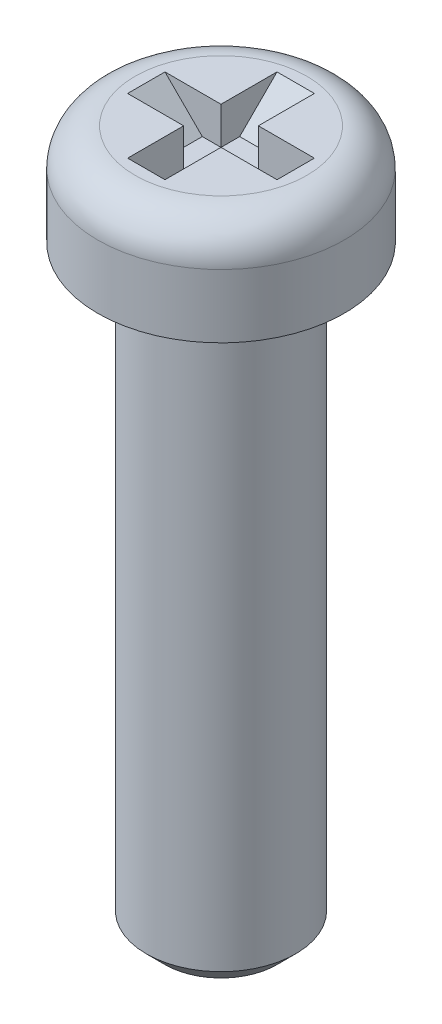
ISO-10303-21;
HEADER;
FILE_DESCRIPTION(('STEP AP214'),'2;1');
FILE_NAME('part.step','',(''),(''),'','','');
FILE_SCHEMA(('AUTOMOTIVE_DESIGN { 1 0 10303 214 1 1 1 1 }'));
ENDSEC;
DATA;
#1=APPLICATION_CONTEXT('core data for automotive mechanical design processes');
#2=APPLICATION_PROTOCOL_DEFINITION('international standard','automotive_design',2000,#1);
#3=PRODUCT_CONTEXT('',#1,'mechanical');
#4=PRODUCT('Part','Part','',(#3));
#5=PRODUCT_RELATED_PRODUCT_CATEGORY('part','',(#4));
#6=PRODUCT_DEFINITION_FORMATION('','',#4);
#7=PRODUCT_DEFINITION_CONTEXT('part definition',#1,'design');
#8=PRODUCT_DEFINITION('design','',#6,#7);
#9=PRODUCT_DEFINITION_SHAPE('','',#8);
#10=(LENGTH_UNIT() NAMED_UNIT(*) SI_UNIT(.MILLI.,.METRE.));
#11=(NAMED_UNIT(*) PLANE_ANGLE_UNIT() SI_UNIT($,.RADIAN.));
#12=(NAMED_UNIT(*) SI_UNIT($,.STERADIAN.) SOLID_ANGLE_UNIT());
#13=UNCERTAINTY_MEASURE_WITH_UNIT(LENGTH_MEASURE(1.E-05),#10,'distance_accuracy_value','');
#14=(GEOMETRIC_REPRESENTATION_CONTEXT(3) GLOBAL_UNCERTAINTY_ASSIGNED_CONTEXT((#13)) GLOBAL_UNIT_ASSIGNED_CONTEXT((#10,
#11,#12)) REPRESENTATION_CONTEXT('',''));
#15=CARTESIAN_POINT('',(0.,0.,0.));
#16=DIRECTION('',(0.,0.,1.));
#17=DIRECTION('',(1.,0.,0.));
#18=AXIS2_PLACEMENT_3D('',#15,#16,#17);
#19=CARTESIAN_POINT('',(0.,16.,0.));
#20=DIRECTION('',(0.,-1.,0.));
#21=DIRECTION('',(0.,0.,-1.));
#22=AXIS2_PLACEMENT_3D('',#19,#20,#21);
#23=CYLINDRICAL_SURFACE('',#22,2.);
#24=CARTESIAN_POINT('',(0.,0.5,0.));
#25=DIRECTION('',(0.,1.,0.));
#26=DIRECTION('',(0.,0.,1.));
#27=AXIS2_PLACEMENT_3D('',#24,#25,#26);
#28=CIRCLE('',#27,2.);
#29=CARTESIAN_POINT('',(0.,0.5,2.));
#30=VERTEX_POINT('',#29);
#31=EDGE_CURVE('E245',#30,#30,#28,.T.);
#32=ORIENTED_EDGE('',*,*,#31,.T.);
#33=EDGE_LOOP('',(#32));
#34=FACE_BOUND('',#33,.T.);
#35=CARTESIAN_POINT('',(0.,16.,0.));
#36=DIRECTION('',(0.,1.,0.));
#37=DIRECTION('',(0.,0.,1.));
#38=AXIS2_PLACEMENT_3D('',#35,#36,#37);
#39=CIRCLE('',#38,2.);
#40=CARTESIAN_POINT('',(0.,16.,2.));
#41=VERTEX_POINT('',#40);
#42=EDGE_CURVE('E231',#41,#41,#39,.T.);
#43=ORIENTED_EDGE('',*,*,#42,.F.);
#44=EDGE_LOOP('',(#43));
#45=FACE_BOUND('',#44,.T.);
#46=ADVANCED_FACE('F66',(#34,#45),#23,.T.);
#47=CARTESIAN_POINT('',(0.,0.,0.));
#48=DIRECTION('',(0.,1.,0.));
#49=DIRECTION('',(0.,0.,1.));
#50=AXIS2_PLACEMENT_3D('',#47,#48,#49);
#51=PLANE('',#50);
#52=CARTESIAN_POINT('',(0.,0.,0.));
#53=DIRECTION('',(0.,1.,0.));
#54=DIRECTION('',(0.,0.,1.));
#55=AXIS2_PLACEMENT_3D('',#52,#53,#54);
#56=CIRCLE('',#55,1.5);
#57=CARTESIAN_POINT('',(0.,0.,1.5));
#58=VERTEX_POINT('',#57);
#59=EDGE_CURVE('E244',#58,#58,#56,.F.);
#60=ORIENTED_EDGE('',*,*,#59,.T.);
#61=EDGE_LOOP('',(#60));
#62=FACE_BOUND('',#61,.T.);
#63=ADVANCED_FACE('F309',(#62),#51,.F.);
#64=CARTESIAN_POINT('',(0.,18.7,0.));
#65=DIRECTION('',(0.,-1.,0.));
#66=DIRECTION('',(0.,0.,-1.));
#67=AXIS2_PLACEMENT_3D('',#64,#65,#66);
#68=CYLINDRICAL_SURFACE('',#67,3.3);
#69=CARTESIAN_POINT('',(0.,17.7,0.));
#70=DIRECTION('',(0.,1.,0.));
#71=DIRECTION('',(0.,0.,1.));
#72=AXIS2_PLACEMENT_3D('',#69,#70,#71);
#73=CIRCLE('',#72,3.3);
#74=CARTESIAN_POINT('',(0.,17.7,-3.3));
#75=VERTEX_POINT('',#74);
#76=EDGE_CURVE('E237',#75,#75,#73,.F.);
#77=CARTESIAN_POINT('',(0.,16.,0.));
#78=DIRECTION('',(0.,1.,0.));
#79=DIRECTION('',(0.,0.,1.));
#80=AXIS2_PLACEMENT_3D('',#77,#78,#79);
#81=CIRCLE('',#80,3.3);
#82=CARTESIAN_POINT('',(0.,16.,-3.3));
#83=VERTEX_POINT('',#82);
#84=EDGE_CURVE('E219',#83,#83,#81,.T.);
#85=CARTESIAN_POINT('',(0.,17.7,-3.3));
#86=CARTESIAN_POINT('',(0.,17.6822916666667,-3.3));
#87=CARTESIAN_POINT('',(0.,17.6645833333333,-3.3));
#88=CARTESIAN_POINT('',(0.,17.6291666666667,-3.3));
#89=CARTESIAN_POINT('',(0.,17.6114583333333,-3.3));
#90=CARTESIAN_POINT('',(0.,17.5760416666667,-3.3));
#91=CARTESIAN_POINT('',(0.,17.5583333333333,-3.3));
#92=CARTESIAN_POINT('',(0.,17.5229166666667,-3.3));
#93=CARTESIAN_POINT('',(0.,17.5052083333333,-3.3));
#94=CARTESIAN_POINT('',(0.,17.4697916666667,-3.3));
#95=CARTESIAN_POINT('',(0.,17.4520833333333,-3.3));
#96=CARTESIAN_POINT('',(0.,17.4166666666667,-3.3));
#97=CARTESIAN_POINT('',(0.,17.3989583333333,-3.3));
#98=CARTESIAN_POINT('',(0.,17.3635416666667,-3.3));
#99=CARTESIAN_POINT('',(0.,17.3458333333333,-3.3));
#100=CARTESIAN_POINT('',(0.,17.3104166666667,-3.3));
#101=CARTESIAN_POINT('',(0.,17.2927083333333,-3.3));
#102=CARTESIAN_POINT('',(0.,17.2572916666667,-3.3));
#103=CARTESIAN_POINT('',(0.,17.2395833333333,-3.3));
#104=CARTESIAN_POINT('',(0.,17.2041666666667,-3.3));
#105=CARTESIAN_POINT('',(0.,17.1864583333333,-3.3));
#106=CARTESIAN_POINT('',(0.,17.1510416666667,-3.3));
#107=CARTESIAN_POINT('',(0.,17.1333333333333,-3.3));
#108=CARTESIAN_POINT('',(0.,17.0979166666667,-3.3));
#109=CARTESIAN_POINT('',(0.,17.0802083333333,-3.3));
#110=CARTESIAN_POINT('',(0.,17.0447916666667,-3.3));
#111=CARTESIAN_POINT('',(0.,17.0270833333333,-3.3));
#112=CARTESIAN_POINT('',(0.,16.9916666666667,-3.3));
#113=CARTESIAN_POINT('',(0.,16.9739583333333,-3.3));
#114=CARTESIAN_POINT('',(0.,16.9385416666667,-3.3));
#115=CARTESIAN_POINT('',(0.,16.9208333333333,-3.3));
#116=CARTESIAN_POINT('',(0.,16.8854166666667,-3.3));
#117=CARTESIAN_POINT('',(0.,16.8677083333333,-3.3));
#118=CARTESIAN_POINT('',(0.,16.8322916666667,-3.3));
#119=CARTESIAN_POINT('',(0.,16.8145833333333,-3.3));
#120=CARTESIAN_POINT('',(0.,16.7791666666667,-3.3));
#121=CARTESIAN_POINT('',(0.,16.7614583333333,-3.3));
#122=CARTESIAN_POINT('',(0.,16.7260416666667,-3.3));
#123=CARTESIAN_POINT('',(0.,16.7083333333333,-3.3));
#124=CARTESIAN_POINT('',(0.,16.6729166666667,-3.3));
#125=CARTESIAN_POINT('',(0.,16.6552083333333,-3.3));
#126=CARTESIAN_POINT('',(0.,16.6197916666667,-3.3));
#127=CARTESIAN_POINT('',(0.,16.6020833333333,-3.3));
#128=CARTESIAN_POINT('',(0.,16.5666666666667,-3.3));
#129=CARTESIAN_POINT('',(0.,16.5489583333333,-3.3));
#130=CARTESIAN_POINT('',(0.,16.5135416666667,-3.3));
#131=CARTESIAN_POINT('',(0.,16.4958333333333,-3.3));
#132=CARTESIAN_POINT('',(0.,16.4604166666667,-3.3));
#133=CARTESIAN_POINT('',(0.,16.4427083333333,-3.3));
#134=CARTESIAN_POINT('',(0.,16.4072916666667,-3.3));
#135=CARTESIAN_POINT('',(0.,16.3895833333333,-3.3));
#136=CARTESIAN_POINT('',(0.,16.3541666666667,-3.3));
#137=CARTESIAN_POINT('',(0.,16.3364583333333,-3.3));
#138=CARTESIAN_POINT('',(0.,16.3010416666667,-3.3));
#139=CARTESIAN_POINT('',(0.,16.2833333333333,-3.3));
#140=CARTESIAN_POINT('',(0.,16.2479166666667,-3.3));
#141=CARTESIAN_POINT('',(0.,16.2302083333333,-3.3));
#142=CARTESIAN_POINT('',(0.,16.1947916666667,-3.3));
#143=CARTESIAN_POINT('',(0.,16.1770833333333,-3.3));
#144=CARTESIAN_POINT('',(0.,16.1416666666667,-3.3));
#145=CARTESIAN_POINT('',(0.,16.1239583333333,-3.3));
#146=CARTESIAN_POINT('',(0.,16.0885416666667,-3.3));
#147=CARTESIAN_POINT('',(0.,16.0708333333333,-3.3));
#148=CARTESIAN_POINT('',(0.,16.0354166666667,-3.3));
#149=CARTESIAN_POINT('',(0.,16.0177083333333,-3.3));
#150=CARTESIAN_POINT('',(0.,16.,-3.3));
#151=B_SPLINE_CURVE_WITH_KNOTS('',3,(#85,#86,#87,#88,#89,#90,#91,#92,#93,#94,#95,#96,#97,#98,
#99,#100,#101,#102,#103,#104,#105,#106,#107,#108,#109,#110,#111,#112,#113,#114,#115,#116,#117,
#118,#119,#120,#121,#122,#123,#124,#125,#126,#127,#128,#129,#130,#131,#132,#133,#134,#135,#136,
#137,#138,#139,#140,#141,#142,#143,#144,#145,#146,#147,#148,#149,#150),.UNSPECIFIED.,.F.,.F.,(4,
2,2,2,2,2,2,2,2,2,2,2,2,2,2,2,2,2,2,2,2,2,2,2,2,2,2,2,2,2,2,2,4),(0.,0.0531249999999976,
0.106249999999999,0.159375,0.212499999999997,0.265624999999999,0.31875,0.371874999999997,
0.424999999999998,0.478124999999999,0.531249999999997,0.584374999999998,0.637499999999999,
0.690625,0.743749999999998,0.796874999999999,0.85,0.903124999999998,0.956249999999999,1.009375,
1.0625,1.115625,1.16875,1.221875,1.275,1.328125,1.38125,1.434375,1.4875,1.540625,1.59375,
1.646875,1.7),.UNSPECIFIED.);
#152=EDGE_CURVE('BSEAM317',#75,#83,#151,.T.);
#153=ORIENTED_EDGE('',*,*,#76,.T.);
#154=ORIENTED_EDGE('',*,*,#84,.T.);
#155=ORIENTED_EDGE('',*,*,#152,.T.);
#156=ORIENTED_EDGE('',*,*,#152,.F.);
#157=EDGE_LOOP('',(#153,#155,#154,#156));
#158=FACE_BOUND('',#157,.T.);
#159=ADVANCED_FACE('F317',(#158),#68,.T.);
#160=CARTESIAN_POINT('',(0.,18.7,0.));
#161=DIRECTION('',(0.,1.,0.));
#162=DIRECTION('',(0.,0.,1.));
#163=AXIS2_PLACEMENT_3D('',#160,#161,#162);
#164=PLANE('',#163);
#165=DIRECTION('',(0.,0.,-1.));
#166=VECTOR('',#165,1.);
#167=CARTESIAN_POINT('',(-0.5,18.7,-2.));
#168=LINE('',#167,#166);
#169=CARTESIAN_POINT('',(-0.5,18.7,-2.));
#170=VERTEX_POINT('',#169);
#171=CARTESIAN_POINT('',(-0.5,18.7,-0.5));
#172=VERTEX_POINT('',#171);
#173=EDGE_CURVE('E190',#170,#172,#168,.F.);
#174=ORIENTED_EDGE('',*,*,#173,.F.);
#175=DIRECTION('',(1.,0.,0.));
#176=VECTOR('',#175,1.);
#177=CARTESIAN_POINT('',(-0.5,18.7,-2.));
#178=LINE('',#177,#176);
#179=CARTESIAN_POINT('',(0.5,18.7,-2.));
#180=VERTEX_POINT('',#179);
#181=EDGE_CURVE('E193',#170,#180,#178,.T.);
#182=ORIENTED_EDGE('',*,*,#181,.T.);
#183=DIRECTION('',(0.,0.,-1.));
#184=VECTOR('',#183,1.);
#185=CARTESIAN_POINT('',(0.5,18.7,-2.));
#186=LINE('',#185,#184);
#187=CARTESIAN_POINT('',(0.5,18.7,-0.5));
#188=VERTEX_POINT('',#187);
#189=EDGE_CURVE('E185',#180,#188,#186,.F.);
#190=ORIENTED_EDGE('',*,*,#189,.T.);
#191=DIRECTION('',(1.,0.,0.));
#192=VECTOR('',#191,1.);
#193=CARTESIAN_POINT('',(-2.,18.7,-0.5));
#194=LINE('',#193,#192);
#195=CARTESIAN_POINT('',(2.,18.7,-0.500000000000001));
#196=VERTEX_POINT('',#195);
#197=EDGE_CURVE('E221',#188,#196,#194,.T.);
#198=ORIENTED_EDGE('',*,*,#197,.T.);
#199=DIRECTION('',(0.,0.,1.));
#200=VECTOR('',#199,1.);
#201=CARTESIAN_POINT('',(2.,18.7,-0.500000000000001));
#202=LINE('',#201,#200);
#203=CARTESIAN_POINT('',(2.,18.7,0.499999999999999));
#204=VERTEX_POINT('',#203);
#205=EDGE_CURVE('E225',#196,#204,#202,.T.);
#206=ORIENTED_EDGE('',*,*,#205,.T.);
#207=DIRECTION('',(1.,0.,0.));
#208=VECTOR('',#207,1.);
#209=CARTESIAN_POINT('',(-2.,18.7,0.5));
#210=LINE('',#209,#208);
#211=CARTESIAN_POINT('',(0.5,18.7,0.5));
#212=VERTEX_POINT('',#211);
#213=EDGE_CURVE('E181',#212,#204,#210,.T.);
#214=ORIENTED_EDGE('',*,*,#213,.F.);
#215=CARTESIAN_POINT('',(0.5,18.7,2.));
#216=VERTEX_POINT('',#215);
#217=EDGE_CURVE('E162',#212,#216,#186,.F.);
#218=ORIENTED_EDGE('',*,*,#217,.T.);
#219=DIRECTION('',(-1.,0.,0.));
#220=VECTOR('',#219,1.);
#221=CARTESIAN_POINT('',(0.5,18.7,2.));
#222=LINE('',#221,#220);
#223=CARTESIAN_POINT('',(-0.5,18.7,2.));
#224=VERTEX_POINT('',#223);
#225=EDGE_CURVE('E178',#216,#224,#222,.T.);
#226=ORIENTED_EDGE('',*,*,#225,.T.);
#227=CARTESIAN_POINT('',(-0.5,18.7,0.5));
#228=VERTEX_POINT('',#227);
#229=EDGE_CURVE('E188',#228,#224,#168,.F.);
#230=ORIENTED_EDGE('',*,*,#229,.F.);
#231=CARTESIAN_POINT('',(-2.,18.7,0.5));
#232=VERTEX_POINT('',#231);
#233=EDGE_CURVE('E216',#232,#228,#210,.T.);
#234=ORIENTED_EDGE('',*,*,#233,.F.);
#235=DIRECTION('',(0.,0.,-1.));
#236=VECTOR('',#235,1.);
#237=CARTESIAN_POINT('',(-2.,18.7,0.5));
#238=LINE('',#237,#236);
#239=CARTESIAN_POINT('',(-2.,18.7,-0.5));
#240=VERTEX_POINT('',#239);
#241=EDGE_CURVE('E226',#232,#240,#238,.T.);
#242=ORIENTED_EDGE('',*,*,#241,.T.);
#243=EDGE_CURVE('E223',#240,#172,#194,.T.);
#244=ORIENTED_EDGE('',*,*,#243,.T.);
#245=EDGE_LOOP('',(#174,#182,#190,#198,#206,#214,#218,#226,#230,#234,#242,#244));
#246=FACE_BOUND('',#245,.T.);
#247=CARTESIAN_POINT('',(0.,18.7,0.));
#248=DIRECTION('',(0.,1.,0.));
#249=DIRECTION('',(0.,0.,1.));
#250=AXIS2_PLACEMENT_3D('',#247,#248,#249);
#251=CIRCLE('',#250,2.3);
#252=CARTESIAN_POINT('',(0.,18.7,2.3));
#253=VERTEX_POINT('',#252);
#254=EDGE_CURVE('E236',#253,#253,#251,.T.);
#255=ORIENTED_EDGE('',*,*,#254,.T.);
#256=EDGE_LOOP('',(#255));
#257=FACE_BOUND('',#256,.T.);
#258=ADVANCED_FACE('F174',(#246,#257),#164,.T.);
#259=CARTESIAN_POINT('',(0.,16.,0.));
#260=DIRECTION('',(0.,1.,0.));
#261=DIRECTION('',(0.,0.,1.));
#262=AXIS2_PLACEMENT_3D('',#259,#260,#261);
#263=PLANE('',#262);
#264=ORIENTED_EDGE('',*,*,#42,.T.);
#265=EDGE_LOOP('',(#264));
#266=FACE_BOUND('',#265,.T.);
#267=ORIENTED_EDGE('',*,*,#84,.F.);
#268=EDGE_LOOP('',(#267));
#269=FACE_BOUND('',#268,.T.);
#270=ADVANCED_FACE('F324',(#266,#269),#263,.F.);
#271=CARTESIAN_POINT('',(0.,17.7,0.));
#272=DIRECTION('',(0.,1.,0.));
#273=DIRECTION('',(0.,0.,1.));
#274=AXIS2_PLACEMENT_3D('',#271,#272,#273);
#275=TOROIDAL_SURFACE('',#274,2.3,1.);
#276=ORIENTED_EDGE('',*,*,#76,.F.);
#277=EDGE_LOOP('',(#276));
#278=FACE_BOUND('',#277,.T.);
#279=ORIENTED_EDGE('',*,*,#254,.F.);
#280=EDGE_LOOP('',(#279));
#281=FACE_BOUND('',#280,.T.);
#282=ADVANCED_FACE('F302',(#278,#281),#275,.T.);
#283=CARTESIAN_POINT('',(0.,0.5,0.));
#284=DIRECTION('',(0.,1.,0.));
#285=DIRECTION('',(0.,0.,1.));
#286=AXIS2_PLACEMENT_3D('',#283,#284,#285);
#287=CONICAL_SURFACE('',#286,2.,0.78539816339745);
#288=ORIENTED_EDGE('',*,*,#59,.F.);
#289=EDGE_LOOP('',(#288));
#290=FACE_BOUND('',#289,.T.);
#291=ORIENTED_EDGE('',*,*,#31,.F.);
#292=EDGE_LOOP('',(#291));
#293=FACE_BOUND('',#292,.T.);
#294=ADVANCED_FACE('F298',(#290,#293),#287,.T.);
#295=CARTESIAN_POINT('',(-2.,17.7,0.5));
#296=DIRECTION('',(0.,0.,1.));
#297=DIRECTION('',(1.,0.,0.));
#298=AXIS2_PLACEMENT_3D('',#295,#296,#297);
#299=PLANE('',#298);
#300=ORIENTED_EDGE('',*,*,#213,.T.);
#301=DIRECTION('',(-0.707106781186545,-0.70710678118655,0.));
#302=VECTOR('',#301,1.);
#303=CARTESIAN_POINT('',(2.,18.7,0.499999999999999));
#304=LINE('',#303,#302);
#305=CARTESIAN_POINT('',(0.999999999999999,17.7,0.5));
#306=VERTEX_POINT('',#305);
#307=EDGE_CURVE('E166',#204,#306,#304,.T.);
#308=ORIENTED_EDGE('',*,*,#307,.T.);
#309=DIRECTION('',(1.,0.,0.));
#310=VECTOR('',#309,1.);
#311=CARTESIAN_POINT('',(-2.,17.7,0.5));
#312=LINE('',#311,#310);
#313=CARTESIAN_POINT('',(0.5,17.7,0.5));
#314=VERTEX_POINT('',#313);
#315=EDGE_CURVE('E211',#314,#306,#312,.T.);
#316=ORIENTED_EDGE('',*,*,#315,.F.);
#317=DIRECTION('',(0.,-1.,0.));
#318=VECTOR('',#317,1.);
#319=CARTESIAN_POINT('',(0.5,17.7,0.5));
#320=LINE('',#319,#318);
#321=EDGE_CURVE('E205',#212,#314,#320,.T.);
#322=ORIENTED_EDGE('',*,*,#321,.F.);
#323=EDGE_LOOP('',(#300,#308,#316,#322));
#324=FACE_BOUND('',#323,.T.);
#325=ADVANCED_FACE('F295',(#324),#299,.F.);
#326=CARTESIAN_POINT('',(-2.,17.7,-0.5));
#327=DIRECTION('',(0.,0.,1.));
#328=DIRECTION('',(1.,0.,0.));
#329=AXIS2_PLACEMENT_3D('',#326,#327,#328);
#330=PLANE('',#329);
#331=DIRECTION('',(1.,0.,0.));
#332=VECTOR('',#331,1.);
#333=CARTESIAN_POINT('',(-2.,17.7,-0.5));
#334=LINE('',#333,#332);
#335=CARTESIAN_POINT('',(0.5,17.7,-0.5));
#336=VERTEX_POINT('',#335);
#337=CARTESIAN_POINT('',(0.999999999999999,17.7,-0.5));
#338=VERTEX_POINT('',#337);
#339=EDGE_CURVE('E214',#336,#338,#334,.T.);
#340=ORIENTED_EDGE('',*,*,#339,.T.);
#341=DIRECTION('',(0.707106781186545,0.70710678118655,0.));
#342=VECTOR('',#341,1.);
#343=CARTESIAN_POINT('',(-0.49999999999999,16.2,-0.5));
#344=LINE('',#343,#342);
#345=EDGE_CURVE('E257',#338,#196,#344,.T.);
#346=ORIENTED_EDGE('',*,*,#345,.T.);
#347=ORIENTED_EDGE('',*,*,#197,.F.);
#348=DIRECTION('',(0.,-1.,0.));
#349=VECTOR('',#348,1.);
#350=CARTESIAN_POINT('',(0.5,17.7,-0.5));
#351=LINE('',#350,#349);
#352=EDGE_CURVE('E196',#188,#336,#351,.T.);
#353=ORIENTED_EDGE('',*,*,#352,.T.);
#354=EDGE_LOOP('',(#340,#346,#347,#353));
#355=FACE_BOUND('',#354,.T.);
#356=ADVANCED_FACE('F290',(#355),#330,.T.);
#357=CARTESIAN_POINT('',(-0.999999999999999,17.7,0.5));
#358=VERTEX_POINT('',#357);
#359=CARTESIAN_POINT('',(-0.5,17.7,0.5));
#360=VERTEX_POINT('',#359);
#361=EDGE_CURVE('E212',#358,#360,#312,.T.);
#362=ORIENTED_EDGE('',*,*,#361,.F.);
#363=DIRECTION('',(-0.707106781186545,0.70710678118655,0.));
#364=VECTOR('',#363,1.);
#365=CARTESIAN_POINT('',(-2.,18.7,0.5));
#366=LINE('',#365,#364);
#367=EDGE_CURVE('E12',#358,#232,#366,.T.);
#368=ORIENTED_EDGE('',*,*,#367,.T.);
#369=ORIENTED_EDGE('',*,*,#233,.T.);
#370=DIRECTION('',(0.,-1.,0.));
#371=VECTOR('',#370,1.);
#372=CARTESIAN_POINT('',(-0.5,17.7,0.5));
#373=LINE('',#372,#371);
#374=EDGE_CURVE('E206',#228,#360,#373,.T.);
#375=ORIENTED_EDGE('',*,*,#374,.T.);
#376=EDGE_LOOP('',(#362,#368,#369,#375));
#377=FACE_BOUND('',#376,.T.);
#378=ADVANCED_FACE('F274',(#377),#299,.F.);
#379=ORIENTED_EDGE('',*,*,#243,.F.);
#380=DIRECTION('',(0.707106781186545,-0.70710678118655,0.));
#381=VECTOR('',#380,1.);
#382=CARTESIAN_POINT('',(-1.5,18.2,-0.5));
#383=LINE('',#382,#381);
#384=CARTESIAN_POINT('',(-0.999999999999999,17.7,-0.5));
#385=VERTEX_POINT('',#384);
#386=EDGE_CURVE('E76',#240,#385,#383,.T.);
#387=ORIENTED_EDGE('',*,*,#386,.T.);
#388=CARTESIAN_POINT('',(-0.5,17.7,-0.5));
#389=VERTEX_POINT('',#388);
#390=EDGE_CURVE('E213',#385,#389,#334,.T.);
#391=ORIENTED_EDGE('',*,*,#390,.T.);
#392=DIRECTION('',(0.,-1.,0.));
#393=VECTOR('',#392,1.);
#394=CARTESIAN_POINT('',(-0.5,17.7,-0.5));
#395=LINE('',#394,#393);
#396=EDGE_CURVE('E203',#172,#389,#395,.T.);
#397=ORIENTED_EDGE('',*,*,#396,.F.);
#398=EDGE_LOOP('',(#379,#387,#391,#397));
#399=FACE_BOUND('',#398,.T.);
#400=ADVANCED_FACE('F264',(#399),#330,.T.);
#401=CARTESIAN_POINT('',(0.,17.7,0.));
#402=DIRECTION('',(0.,-1.,0.));
#403=DIRECTION('',(-1.,0.,0.));
#404=AXIS2_PLACEMENT_3D('',#401,#402,#403);
#405=PLANE('',#404);
#406=DIRECTION('',(0.,0.,-1.));
#407=VECTOR('',#406,1.);
#408=CARTESIAN_POINT('',(-0.5,17.7,-2.));
#409=LINE('',#408,#407);
#410=CARTESIAN_POINT('',(-0.5,17.7,0.999999999999999));
#411=VERTEX_POINT('',#410);
#412=EDGE_CURVE('E199',#360,#411,#409,.F.);
#413=ORIENTED_EDGE('',*,*,#412,.T.);
#414=DIRECTION('',(1.,0.,0.));
#415=VECTOR('',#414,1.);
#416=CARTESIAN_POINT('',(0.,17.7,0.999999999999999));
#417=LINE('',#416,#415);
#418=CARTESIAN_POINT('',(0.5,17.7,0.999999999999999));
#419=VERTEX_POINT('',#418);
#420=EDGE_CURVE('E169',#411,#419,#417,.T.);
#421=ORIENTED_EDGE('',*,*,#420,.T.);
#422=DIRECTION('',(0.,0.,-1.));
#423=VECTOR('',#422,1.);
#424=CARTESIAN_POINT('',(0.5,17.7,-2.));
#425=LINE('',#424,#423);
#426=EDGE_CURVE('E165',#314,#419,#425,.F.);
#427=ORIENTED_EDGE('',*,*,#426,.F.);
#428=ORIENTED_EDGE('',*,*,#315,.T.);
#429=DIRECTION('',(0.,0.,-1.));
#430=VECTOR('',#429,1.);
#431=CARTESIAN_POINT('',(0.999999999999999,17.7,0.));
#432=LINE('',#431,#430);
#433=EDGE_CURVE('E255',#306,#338,#432,.T.);
#434=ORIENTED_EDGE('',*,*,#433,.T.);
#435=ORIENTED_EDGE('',*,*,#339,.F.);
#436=CARTESIAN_POINT('',(0.5,17.7,-0.999999999999999));
#437=VERTEX_POINT('',#436);
#438=EDGE_CURVE('E204',#437,#336,#425,.F.);
#439=ORIENTED_EDGE('',*,*,#438,.F.);
#440=DIRECTION('',(-1.,0.,0.));
#441=VECTOR('',#440,1.);
#442=CARTESIAN_POINT('',(0.,17.7,-0.999999999999999));
#443=LINE('',#442,#441);
#444=CARTESIAN_POINT('',(-0.5,17.7,-0.999999999999999));
#445=VERTEX_POINT('',#444);
#446=EDGE_CURVE('E83',#437,#445,#443,.T.);
#447=ORIENTED_EDGE('',*,*,#446,.T.);
#448=EDGE_CURVE('E268',#445,#389,#409,.F.);
#449=ORIENTED_EDGE('',*,*,#448,.T.);
#450=ORIENTED_EDGE('',*,*,#390,.F.);
#451=DIRECTION('',(0.,0.,1.));
#452=VECTOR('',#451,1.);
#453=CARTESIAN_POINT('',(-0.999999999999999,17.7,0.));
#454=LINE('',#453,#452);
#455=EDGE_CURVE('E248',#385,#358,#454,.T.);
#456=ORIENTED_EDGE('',*,*,#455,.T.);
#457=ORIENTED_EDGE('',*,*,#361,.T.);
#458=EDGE_LOOP('',(#413,#421,#427,#428,#434,#435,#439,#447,#449,#450,#456,#457));
#459=FACE_BOUND('',#458,.T.);
#460=ADVANCED_FACE('F269',(#459),#405,.F.);
#461=CARTESIAN_POINT('',(0.5,17.7,-2.));
#462=DIRECTION('',(-1.,0.,0.));
#463=DIRECTION('',(0.,0.,1.));
#464=AXIS2_PLACEMENT_3D('',#461,#462,#463);
#465=PLANE('',#464);
#466=ORIENTED_EDGE('',*,*,#189,.F.);
#467=DIRECTION('',(0.,-0.70710678118655,0.707106781186545));
#468=VECTOR('',#467,1.);
#469=CARTESIAN_POINT('',(0.5,18.2,-1.5));
#470=LINE('',#469,#468);
#471=EDGE_CURVE('E94',#180,#437,#470,.T.);
#472=ORIENTED_EDGE('',*,*,#471,.T.);
#473=ORIENTED_EDGE('',*,*,#438,.T.);
#474=ORIENTED_EDGE('',*,*,#352,.F.);
#475=EDGE_LOOP('',(#466,#472,#473,#474));
#476=FACE_BOUND('',#475,.T.);
#477=ADVANCED_FACE('F282',(#476),#465,.T.);
#478=CARTESIAN_POINT('',(-0.5,17.7,-2.));
#479=DIRECTION('',(-1.,0.,0.));
#480=DIRECTION('',(0.,0.,1.));
#481=AXIS2_PLACEMENT_3D('',#478,#479,#480);
#482=PLANE('',#481);
#483=ORIENTED_EDGE('',*,*,#448,.F.);
#484=DIRECTION('',(0.,0.70710678118655,-0.707106781186545));
#485=VECTOR('',#484,1.);
#486=CARTESIAN_POINT('',(-0.5,18.7,-2.));
#487=LINE('',#486,#485);
#488=EDGE_CURVE('E256',#445,#170,#487,.T.);
#489=ORIENTED_EDGE('',*,*,#488,.T.);
#490=ORIENTED_EDGE('',*,*,#173,.T.);
#491=ORIENTED_EDGE('',*,*,#396,.T.);
#492=EDGE_LOOP('',(#483,#489,#490,#491));
#493=FACE_BOUND('',#492,.T.);
#494=ADVANCED_FACE('F348',(#493),#482,.F.);
#495=ORIENTED_EDGE('',*,*,#229,.T.);
#496=DIRECTION('',(0.,-0.70710678118655,-0.707106781186545));
#497=VECTOR('',#496,1.);
#498=CARTESIAN_POINT('',(-0.5,18.7,2.));
#499=LINE('',#498,#497);
#500=EDGE_CURVE('E184',#224,#411,#499,.T.);
#501=ORIENTED_EDGE('',*,*,#500,.T.);
#502=ORIENTED_EDGE('',*,*,#412,.F.);
#503=ORIENTED_EDGE('',*,*,#374,.F.);
#504=EDGE_LOOP('',(#495,#501,#502,#503));
#505=FACE_BOUND('',#504,.T.);
#506=ADVANCED_FACE('F277',(#505),#482,.F.);
#507=ORIENTED_EDGE('',*,*,#426,.T.);
#508=DIRECTION('',(0.,0.70710678118655,0.707106781186545));
#509=VECTOR('',#508,1.);
#510=CARTESIAN_POINT('',(0.5,16.2,-0.49999999999999));
#511=LINE('',#510,#509);
#512=EDGE_CURVE('E159',#419,#216,#511,.T.);
#513=ORIENTED_EDGE('',*,*,#512,.T.);
#514=ORIENTED_EDGE('',*,*,#217,.F.);
#515=ORIENTED_EDGE('',*,*,#321,.T.);
#516=EDGE_LOOP('',(#507,#513,#514,#515));
#517=FACE_BOUND('',#516,.T.);
#518=ADVANCED_FACE('F158',(#517),#465,.T.);
#519=CARTESIAN_POINT('',(0.5,18.7,2.));
#520=DIRECTION('',(0.,-0.707106781186545,0.70710678118655));
#521=DIRECTION('',(-1.,0.,0.));
#522=AXIS2_PLACEMENT_3D('',#519,#520,#521);
#523=PLANE('',#522);
#524=ORIENTED_EDGE('',*,*,#512,.F.);
#525=ORIENTED_EDGE('',*,*,#420,.F.);
#526=ORIENTED_EDGE('',*,*,#500,.F.);
#527=ORIENTED_EDGE('',*,*,#225,.F.);
#528=EDGE_LOOP('',(#524,#525,#526,#527));
#529=FACE_BOUND('',#528,.T.);
#530=ADVANCED_FACE('F183',(#529),#523,.F.);
#531=CARTESIAN_POINT('',(2.,18.7,-0.500000000000001));
#532=DIRECTION('',(0.70710678118655,-0.707106781186545,0.));
#533=DIRECTION('',(0.,0.,1.));
#534=AXIS2_PLACEMENT_3D('',#531,#532,#533);
#535=PLANE('',#534);
#536=ORIENTED_EDGE('',*,*,#345,.F.);
#537=ORIENTED_EDGE('',*,*,#433,.F.);
#538=ORIENTED_EDGE('',*,*,#307,.F.);
#539=ORIENTED_EDGE('',*,*,#205,.F.);
#540=EDGE_LOOP('',(#536,#537,#538,#539));
#541=FACE_BOUND('',#540,.T.);
#542=ADVANCED_FACE('F293',(#541),#535,.F.);
#543=CARTESIAN_POINT('',(-0.5,18.7,-2.));
#544=DIRECTION('',(0.,-0.707106781186545,-0.70710678118655));
#545=DIRECTION('',(1.,0.,0.));
#546=AXIS2_PLACEMENT_3D('',#543,#544,#545);
#547=PLANE('',#546);
#548=ORIENTED_EDGE('',*,*,#488,.F.);
#549=ORIENTED_EDGE('',*,*,#446,.F.);
#550=ORIENTED_EDGE('',*,*,#471,.F.);
#551=ORIENTED_EDGE('',*,*,#181,.F.);
#552=EDGE_LOOP('',(#548,#549,#550,#551));
#553=FACE_BOUND('',#552,.T.);
#554=ADVANCED_FACE('F339',(#553),#547,.F.);
#555=CARTESIAN_POINT('',(-2.,18.7,0.5));
#556=DIRECTION('',(-0.70710678118655,-0.707106781186545,0.));
#557=DIRECTION('',(0.,0.,-1.));
#558=AXIS2_PLACEMENT_3D('',#555,#556,#557);
#559=PLANE('',#558);
#560=ORIENTED_EDGE('',*,*,#367,.F.);
#561=ORIENTED_EDGE('',*,*,#455,.F.);
#562=ORIENTED_EDGE('',*,*,#386,.F.);
#563=ORIENTED_EDGE('',*,*,#241,.F.);
#564=EDGE_LOOP('',(#560,#561,#562,#563));
#565=FACE_BOUND('',#564,.T.);
#566=ADVANCED_FACE('F75',(#565),#559,.F.);
#567=CLOSED_SHELL('',(#46,#63,#159,#258,#270,#282,#294,#325,#356,#378,#400,#460,#477,#494,#506,
#518,#530,#542,#554,#566));
#568=MANIFOLD_SOLID_BREP('B2',#567);
#569=ADVANCED_BREP_SHAPE_REPRESENTATION('',(#18,#568),#14);
#570=SHAPE_DEFINITION_REPRESENTATION(#9,#569);
ENDSEC;
END-ISO-10303-21;
